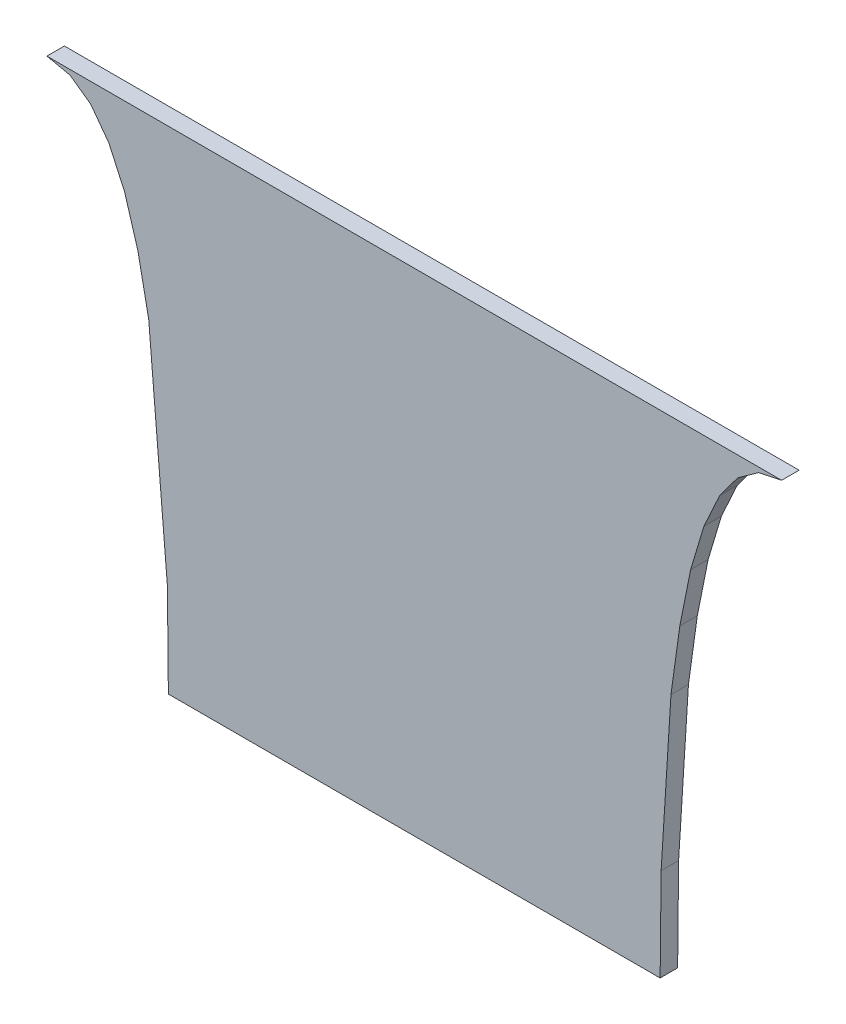
ISO-10303-21;
HEADER;
FILE_DESCRIPTION(('STEP AP214'),'2;1');
FILE_NAME('part.step','',(''),(''),'','','');
FILE_SCHEMA(('AUTOMOTIVE_DESIGN { 1 0 10303 214 1 1 1 1 }'));
ENDSEC;
DATA;
#1=APPLICATION_CONTEXT('core data for automotive mechanical design processes');
#2=APPLICATION_PROTOCOL_DEFINITION('international standard','automotive_design',2000,#1);
#3=PRODUCT_CONTEXT('',#1,'mechanical');
#4=PRODUCT('Part','Part','',(#3));
#5=PRODUCT_RELATED_PRODUCT_CATEGORY('part','',(#4));
#6=PRODUCT_DEFINITION_FORMATION('','',#4);
#7=PRODUCT_DEFINITION_CONTEXT('part definition',#1,'design');
#8=PRODUCT_DEFINITION('design','',#6,#7);
#9=PRODUCT_DEFINITION_SHAPE('','',#8);
#10=(LENGTH_UNIT() NAMED_UNIT(*) SI_UNIT(.MILLI.,.METRE.));
#11=(NAMED_UNIT(*) PLANE_ANGLE_UNIT() SI_UNIT($,.RADIAN.));
#12=(NAMED_UNIT(*) SI_UNIT($,.STERADIAN.) SOLID_ANGLE_UNIT());
#13=UNCERTAINTY_MEASURE_WITH_UNIT(LENGTH_MEASURE(1.E-05),#10,'distance_accuracy_value','');
#14=(GEOMETRIC_REPRESENTATION_CONTEXT(3) GLOBAL_UNCERTAINTY_ASSIGNED_CONTEXT((#13)) GLOBAL_UNIT_ASSIGNED_CONTEXT((#10,
#11,#12)) REPRESENTATION_CONTEXT('',''));
#15=CARTESIAN_POINT('',(0.,0.,0.));
#16=DIRECTION('',(0.,0.,1.));
#17=DIRECTION('',(1.,0.,0.));
#18=AXIS2_PLACEMENT_3D('',#15,#16,#17);
#19=CARTESIAN_POINT('',(88.4000015258789,44.3330001831055,0.));
#20=DIRECTION('',(-0.999944662980935,0.0105200273737027,0.));
#21=DIRECTION('',(0.0105200273737027,0.999944662980935,0.));
#22=AXIS2_PLACEMENT_3D('',#19,#20,#21);
#23=PLANE('',#22);
#24=DIRECTION('',(0.0105200273737027,0.999944662980935,0.));
#25=VECTOR('',#24,1.);
#26=CARTESIAN_POINT('',(88.4000015258789,44.3330001831055,0.03556));
#27=LINE('',#26,#25);
#28=CARTESIAN_POINT('',(88.4000015258789,44.3330001831055,0.03556));
#29=VERTEX_POINT('',#28);
#30=CARTESIAN_POINT('',(88.4020004272461,44.5229988098144,0.03556));
#31=VERTEX_POINT('',#30);
#32=EDGE_CURVE('E11',#29,#31,#27,.T.);
#33=ORIENTED_EDGE('',*,*,#32,.F.);
#34=DIRECTION('',(0.,0.,1.));
#35=VECTOR('',#34,1.);
#36=CARTESIAN_POINT('',(88.4000015258789,44.3330001831055,0.));
#37=LINE('',#36,#35);
#38=CARTESIAN_POINT('',(88.4000015258789,44.3330001831055,0.));
#39=VERTEX_POINT('',#38);
#40=EDGE_CURVE('E24',#39,#29,#37,.T.);
#41=ORIENTED_EDGE('',*,*,#40,.F.);
#42=DIRECTION('',(0.0105200273737027,0.999944662980935,0.));
#43=VECTOR('',#42,1.);
#44=CARTESIAN_POINT('',(88.4000015258789,44.3330001831055,0.));
#45=LINE('',#44,#43);
#46=CARTESIAN_POINT('',(88.4020004272461,44.5229988098144,0.));
#47=VERTEX_POINT('',#46);
#48=EDGE_CURVE('E166',#39,#47,#45,.T.);
#49=ORIENTED_EDGE('',*,*,#48,.T.);
#50=DIRECTION('',(0.,0.,1.));
#51=VECTOR('',#50,1.);
#52=CARTESIAN_POINT('',(88.4020004272461,44.5229988098144,0.));
#53=LINE('',#52,#51);
#54=EDGE_CURVE('E37',#47,#31,#53,.T.);
#55=ORIENTED_EDGE('',*,*,#54,.T.);
#56=EDGE_LOOP('',(#33,#41,#49,#55));
#57=FACE_BOUND('',#56,.T.);
#58=ADVANCED_FACE('F17',(#57),#23,.F.);
#59=CARTESIAN_POINT('',(88.4020004272461,44.5229988098144,0.));
#60=DIRECTION('',(-0.998053226554546,0.0623679161433246,0.));
#61=DIRECTION('',(0.0623679161433246,0.998053226554546,0.));
#62=AXIS2_PLACEMENT_3D('',#59,#60,#61);
#63=PLANE('',#62);
#64=DIRECTION('',(0.0623679161433246,0.998053226554546,0.));
#65=VECTOR('',#64,1.);
#66=CARTESIAN_POINT('',(88.4020004272461,44.5229988098144,0.03556));
#67=LINE('',#66,#65);
#68=CARTESIAN_POINT('',(88.4219970703125,44.8429985046387,0.03556));
#69=VERTEX_POINT('',#68);
#70=EDGE_CURVE('E294',#31,#69,#67,.T.);
#71=ORIENTED_EDGE('',*,*,#70,.F.);
#72=ORIENTED_EDGE('',*,*,#54,.F.);
#73=DIRECTION('',(0.0623679161433246,0.998053226554546,0.));
#74=VECTOR('',#73,1.);
#75=CARTESIAN_POINT('',(88.4020004272461,44.5229988098144,0.));
#76=LINE('',#75,#74);
#77=CARTESIAN_POINT('',(88.4219970703125,44.8429985046387,0.));
#78=VERTEX_POINT('',#77);
#79=EDGE_CURVE('E291',#47,#78,#76,.T.);
#80=ORIENTED_EDGE('',*,*,#79,.T.);
#81=DIRECTION('',(0.,0.,1.));
#82=VECTOR('',#81,1.);
#83=CARTESIAN_POINT('',(88.4219970703125,44.8429985046387,0.));
#84=LINE('',#83,#82);
#85=EDGE_CURVE('E289',#78,#69,#84,.T.);
#86=ORIENTED_EDGE('',*,*,#85,.T.);
#87=EDGE_LOOP('',(#71,#72,#80,#86));
#88=FACE_BOUND('',#87,.T.);
#89=ADVANCED_FACE('F302',(#88),#63,.F.);
#90=CARTESIAN_POINT('',(88.4219970703125,44.8429985046387,0.));
#91=DIRECTION('',(-0.990544459130472,0.137192107957858,0.));
#92=DIRECTION('',(0.137192107957858,0.990544459130472,0.));
#93=AXIS2_PLACEMENT_3D('',#90,#91,#92);
#94=PLANE('',#93);
#95=DIRECTION('',(0.137192107957858,0.990544459130472,0.));
#96=VECTOR('',#95,1.);
#97=CARTESIAN_POINT('',(88.4219970703125,44.8429985046387,0.03556));
#98=LINE('',#97,#96);
#99=CARTESIAN_POINT('',(88.4400024414062,44.9729995727539,0.03556));
#100=VERTEX_POINT('',#99);
#101=EDGE_CURVE('E286',#69,#100,#98,.T.);
#102=ORIENTED_EDGE('',*,*,#101,.F.);
#103=ORIENTED_EDGE('',*,*,#85,.F.);
#104=DIRECTION('',(0.137192107957858,0.990544459130472,0.));
#105=VECTOR('',#104,1.);
#106=CARTESIAN_POINT('',(88.4219970703125,44.8429985046387,0.));
#107=LINE('',#106,#105);
#108=CARTESIAN_POINT('',(88.4400024414062,44.9729995727539,0.));
#109=VERTEX_POINT('',#108);
#110=EDGE_CURVE('E283',#78,#109,#107,.T.);
#111=ORIENTED_EDGE('',*,*,#110,.T.);
#112=DIRECTION('',(0.,0.,1.));
#113=VECTOR('',#112,1.);
#114=CARTESIAN_POINT('',(88.4400024414062,44.9729995727539,0.));
#115=LINE('',#114,#113);
#116=EDGE_CURVE('E281',#109,#100,#115,.T.);
#117=ORIENTED_EDGE('',*,*,#116,.T.);
#118=EDGE_LOOP('',(#102,#103,#111,#117));
#119=FACE_BOUND('',#118,.T.);
#120=ADVANCED_FACE('F308',(#119),#94,.F.);
#121=CARTESIAN_POINT('',(88.4400024414062,44.9729995727539,0.));
#122=DIRECTION('',(-0.980588522376379,0.196076897628735,0.));
#123=DIRECTION('',(0.196076897628735,0.980588522376379,0.));
#124=AXIS2_PLACEMENT_3D('',#121,#122,#123);
#125=PLANE('',#124);
#126=DIRECTION('',(0.196076897628735,0.980588522376379,0.));
#127=VECTOR('',#126,1.);
#128=CARTESIAN_POINT('',(88.4400024414062,44.9729995727539,0.03556));
#129=LINE('',#128,#127);
#130=CARTESIAN_POINT('',(88.4619979858398,45.0830001831055,0.03556));
#131=VERTEX_POINT('',#130);
#132=EDGE_CURVE('E278',#100,#131,#129,.T.);
#133=ORIENTED_EDGE('',*,*,#132,.F.);
#134=ORIENTED_EDGE('',*,*,#116,.F.);
#135=DIRECTION('',(0.196076897628735,0.980588522376379,0.));
#136=VECTOR('',#135,1.);
#137=CARTESIAN_POINT('',(88.4400024414062,44.9729995727539,0.));
#138=LINE('',#137,#136);
#139=CARTESIAN_POINT('',(88.4619979858398,45.0830001831055,0.));
#140=VERTEX_POINT('',#139);
#141=EDGE_CURVE('E275',#109,#140,#138,.T.);
#142=ORIENTED_EDGE('',*,*,#141,.T.);
#143=DIRECTION('',(0.,0.,1.));
#144=VECTOR('',#143,1.);
#145=CARTESIAN_POINT('',(88.4619979858398,45.0830001831055,0.));
#146=LINE('',#145,#144);
#147=EDGE_CURVE('E273',#140,#131,#146,.T.);
#148=ORIENTED_EDGE('',*,*,#147,.T.);
#149=EDGE_LOOP('',(#133,#134,#142,#148));
#150=FACE_BOUND('',#149,.T.);
#151=ADVANCED_FACE('F310',(#150),#125,.F.);
#152=CARTESIAN_POINT('',(88.4619979858398,45.0830001831055,0.));
#153=DIRECTION('',(-0.957825167841783,0.287351610137928,0.));
#154=DIRECTION('',(0.287351610137928,0.957825167841783,0.));
#155=AXIS2_PLACEMENT_3D('',#152,#153,#154);
#156=PLANE('',#155);
#157=DIRECTION('',(0.287351610137928,0.957825167841783,0.));
#158=VECTOR('',#157,1.);
#159=CARTESIAN_POINT('',(88.4619979858398,45.0830001831055,0.03556));
#160=LINE('',#159,#158);
#161=CARTESIAN_POINT('',(88.4889984130859,45.1730003356934,0.03556));
#162=VERTEX_POINT('',#161);
#163=EDGE_CURVE('E270',#131,#162,#160,.T.);
#164=ORIENTED_EDGE('',*,*,#163,.F.);
#165=ORIENTED_EDGE('',*,*,#147,.F.);
#166=DIRECTION('',(0.287351610137928,0.957825167841783,0.));
#167=VECTOR('',#166,1.);
#168=CARTESIAN_POINT('',(88.4619979858398,45.0830001831055,0.));
#169=LINE('',#168,#167);
#170=CARTESIAN_POINT('',(88.4889984130859,45.1730003356934,0.));
#171=VERTEX_POINT('',#170);
#172=EDGE_CURVE('E267',#140,#171,#169,.T.);
#173=ORIENTED_EDGE('',*,*,#172,.T.);
#174=DIRECTION('',(0.,0.,1.));
#175=VECTOR('',#174,1.);
#176=CARTESIAN_POINT('',(88.4889984130859,45.1730003356934,0.));
#177=LINE('',#176,#175);
#178=EDGE_CURVE('E265',#171,#162,#177,.T.);
#179=ORIENTED_EDGE('',*,*,#178,.T.);
#180=EDGE_LOOP('',(#164,#165,#173,#179));
#181=FACE_BOUND('',#180,.T.);
#182=ADVANCED_FACE('F315',(#181),#156,.F.);
#183=CARTESIAN_POINT('',(88.4889984130859,45.1730003356934,0.));
#184=DIRECTION('',(-0.909447701960834,0.415818322585907,0.));
#185=DIRECTION('',(0.415818322585907,0.909447701960834,0.));
#186=AXIS2_PLACEMENT_3D('',#183,#184,#185);
#187=PLANE('',#186);
#188=DIRECTION('',(0.415818322585907,0.909447701960834,0.));
#189=VECTOR('',#188,1.);
#190=CARTESIAN_POINT('',(88.4889984130859,45.1730003356934,0.03556));
#191=LINE('',#190,#189);
#192=CARTESIAN_POINT('',(88.5210037231445,45.2430000305176,0.03556));
#193=VERTEX_POINT('',#192);
#194=EDGE_CURVE('E262',#162,#193,#191,.T.);
#195=ORIENTED_EDGE('',*,*,#194,.F.);
#196=ORIENTED_EDGE('',*,*,#178,.F.);
#197=DIRECTION('',(0.415818322585907,0.909447701960834,0.));
#198=VECTOR('',#197,1.);
#199=CARTESIAN_POINT('',(88.4889984130859,45.1730003356934,0.));
#200=LINE('',#199,#198);
#201=CARTESIAN_POINT('',(88.5210037231445,45.2430000305176,0.));
#202=VERTEX_POINT('',#201);
#203=EDGE_CURVE('E259',#171,#202,#200,.T.);
#204=ORIENTED_EDGE('',*,*,#203,.T.);
#205=DIRECTION('',(0.,0.,1.));
#206=VECTOR('',#205,1.);
#207=CARTESIAN_POINT('',(88.5210037231445,45.2430000305176,0.));
#208=LINE('',#207,#206);
#209=EDGE_CURVE('E257',#202,#193,#208,.T.);
#210=ORIENTED_EDGE('',*,*,#209,.T.);
#211=EDGE_LOOP('',(#195,#196,#204,#210));
#212=FACE_BOUND('',#211,.T.);
#213=ADVANCED_FACE('F318',(#212),#187,.F.);
#214=CARTESIAN_POINT('',(88.5210037231445,45.2430000305176,0.));
#215=DIRECTION('',(-0.803876503017162,0.594796240654645,0.));
#216=DIRECTION('',(0.594796240654645,0.803876503017162,0.));
#217=AXIS2_PLACEMENT_3D('',#214,#215,#216);
#218=PLANE('',#217);
#219=DIRECTION('',(0.594796240654645,0.803876503017162,0.));
#220=VECTOR('',#219,1.);
#221=CARTESIAN_POINT('',(88.5210037231445,45.2430000305176,0.03556));
#222=LINE('',#221,#220);
#223=CARTESIAN_POINT('',(88.5579986572266,45.2929992675781,0.03556));
#224=VERTEX_POINT('',#223);
#225=EDGE_CURVE('E254',#193,#224,#222,.T.);
#226=ORIENTED_EDGE('',*,*,#225,.F.);
#227=ORIENTED_EDGE('',*,*,#209,.F.);
#228=DIRECTION('',(0.594796240654645,0.803876503017162,0.));
#229=VECTOR('',#228,1.);
#230=CARTESIAN_POINT('',(88.5210037231445,45.2430000305176,0.));
#231=LINE('',#230,#229);
#232=CARTESIAN_POINT('',(88.5579986572266,45.2929992675781,0.));
#233=VERTEX_POINT('',#232);
#234=EDGE_CURVE('E251',#202,#233,#231,.T.);
#235=ORIENTED_EDGE('',*,*,#234,.T.);
#236=DIRECTION('',(0.,0.,1.));
#237=VECTOR('',#236,1.);
#238=CARTESIAN_POINT('',(88.5579986572266,45.2929992675781,0.));
#239=LINE('',#238,#237);
#240=EDGE_CURVE('E249',#233,#224,#239,.T.);
#241=ORIENTED_EDGE('',*,*,#240,.T.);
#242=EDGE_LOOP('',(#226,#227,#235,#241));
#243=FACE_BOUND('',#242,.T.);
#244=ADVANCED_FACE('F323',(#243),#218,.F.);
#245=CARTESIAN_POINT('',(88.5579986572266,45.2929992675781,0.));
#246=DIRECTION('',(-0.58127314887122,0.813708502107073,0.));
#247=DIRECTION('',(0.813708502107073,0.58127314887122,0.));
#248=AXIS2_PLACEMENT_3D('',#245,#246,#247);
#249=PLANE('',#248);
#250=DIRECTION('',(0.813708502107073,0.58127314887122,0.));
#251=VECTOR('',#250,1.);
#252=CARTESIAN_POINT('',(88.5579986572266,45.2929992675781,0.03556));
#253=LINE('',#252,#251);
#254=CARTESIAN_POINT('',(88.5999984741211,45.3230018615723,0.03556));
#255=VERTEX_POINT('',#254);
#256=EDGE_CURVE('E246',#224,#255,#253,.T.);
#257=ORIENTED_EDGE('',*,*,#256,.F.);
#258=ORIENTED_EDGE('',*,*,#240,.F.);
#259=DIRECTION('',(0.813708502107073,0.58127314887122,0.));
#260=VECTOR('',#259,1.);
#261=CARTESIAN_POINT('',(88.5579986572266,45.2929992675781,0.));
#262=LINE('',#261,#260);
#263=CARTESIAN_POINT('',(88.5999984741211,45.3230018615723,0.));
#264=VERTEX_POINT('',#263);
#265=EDGE_CURVE('E243',#233,#264,#262,.T.);
#266=ORIENTED_EDGE('',*,*,#265,.T.);
#267=DIRECTION('',(0.,0.,1.));
#268=VECTOR('',#267,1.);
#269=CARTESIAN_POINT('',(88.5999984741211,45.3230018615723,0.));
#270=LINE('',#269,#268);
#271=EDGE_CURVE('E241',#264,#255,#270,.T.);
#272=ORIENTED_EDGE('',*,*,#271,.T.);
#273=EDGE_LOOP('',(#257,#258,#266,#272));
#274=FACE_BOUND('',#273,.T.);
#275=ADVANCED_FACE('F326',(#274),#249,.F.);
#276=CARTESIAN_POINT('',(88.5999984741211,45.3230018615723,0.));
#277=DIRECTION('',(-0.208054323241225,0.97811727240686,0.));
#278=DIRECTION('',(0.97811727240686,0.208054323241225,0.));
#279=AXIS2_PLACEMENT_3D('',#276,#277,#278);
#280=PLANE('',#279);
#281=DIRECTION('',(0.97811727240686,0.208054323241225,0.));
#282=VECTOR('',#281,1.);
#283=CARTESIAN_POINT('',(88.5999984741211,45.3230018615723,0.03556));
#284=LINE('',#283,#282);
#285=CARTESIAN_POINT('',(88.6470031738281,45.3330001831055,0.03556));
#286=VERTEX_POINT('',#285);
#287=EDGE_CURVE('E238',#255,#286,#284,.T.);
#288=ORIENTED_EDGE('',*,*,#287,.F.);
#289=ORIENTED_EDGE('',*,*,#271,.F.);
#290=DIRECTION('',(0.97811727240686,0.208054323241225,0.));
#291=VECTOR('',#290,1.);
#292=CARTESIAN_POINT('',(88.5999984741211,45.3230018615723,0.));
#293=LINE('',#292,#291);
#294=CARTESIAN_POINT('',(88.6470031738281,45.3330001831055,0.));
#295=VERTEX_POINT('',#294);
#296=EDGE_CURVE('E235',#264,#295,#293,.T.);
#297=ORIENTED_EDGE('',*,*,#296,.T.);
#298=DIRECTION('',(0.,0.,1.));
#299=VECTOR('',#298,1.);
#300=CARTESIAN_POINT('',(88.6470031738281,45.3330001831055,0.));
#301=LINE('',#300,#299);
#302=EDGE_CURVE('E233',#295,#286,#301,.T.);
#303=ORIENTED_EDGE('',*,*,#302,.T.);
#304=EDGE_LOOP('',(#288,#289,#297,#303));
#305=FACE_BOUND('',#304,.T.);
#306=ADVANCED_FACE('F331',(#305),#280,.F.);
#307=CARTESIAN_POINT('',(88.6470031738281,45.3330001831055,0.));
#308=DIRECTION('',(0.,-1.,0.));
#309=DIRECTION('',(-1.,0.,0.));
#310=AXIS2_PLACEMENT_3D('',#307,#308,#309);
#311=PLANE('',#310);
#312=DIRECTION('',(-1.,0.,0.));
#313=VECTOR('',#312,1.);
#314=CARTESIAN_POINT('',(88.6470031738281,45.3330001831055,0.03556));
#315=LINE('',#314,#313);
#316=CARTESIAN_POINT('',(87.1529998779297,45.3330001831055,0.03556));
#317=VERTEX_POINT('',#316);
#318=EDGE_CURVE('E230',#286,#317,#315,.T.);
#319=ORIENTED_EDGE('',*,*,#318,.F.);
#320=ORIENTED_EDGE('',*,*,#302,.F.);
#321=DIRECTION('',(-1.,0.,0.));
#322=VECTOR('',#321,1.);
#323=CARTESIAN_POINT('',(88.6470031738281,45.3330001831055,0.));
#324=LINE('',#323,#322);
#325=CARTESIAN_POINT('',(87.1529998779297,45.3330001831055,0.));
#326=VERTEX_POINT('',#325);
#327=EDGE_CURVE('E227',#295,#326,#324,.T.);
#328=ORIENTED_EDGE('',*,*,#327,.T.);
#329=DIRECTION('',(0.,0.,1.));
#330=VECTOR('',#329,1.);
#331=CARTESIAN_POINT('',(87.1529998779297,45.3330001831055,0.));
#332=LINE('',#331,#330);
#333=EDGE_CURVE('E225',#326,#317,#332,.T.);
#334=ORIENTED_EDGE('',*,*,#333,.T.);
#335=EDGE_LOOP('',(#319,#320,#328,#334));
#336=FACE_BOUND('',#335,.T.);
#337=ADVANCED_FACE('F334',(#336),#311,.F.);
#338=CARTESIAN_POINT('',(87.1529998779297,45.3330001831055,0.));
#339=DIRECTION('',(0.208086635945853,0.978110398646665,0.));
#340=DIRECTION('',(0.978110398646665,-0.208086635945853,0.));
#341=AXIS2_PLACEMENT_3D('',#338,#339,#340);
#342=PLANE('',#341);
#343=DIRECTION('',(0.978110398646665,-0.208086635945853,0.));
#344=VECTOR('',#343,1.);
#345=CARTESIAN_POINT('',(87.1529998779297,45.3330001831055,0.03556));
#346=LINE('',#345,#344);
#347=CARTESIAN_POINT('',(87.1999969482422,45.3230018615723,0.03556));
#348=VERTEX_POINT('',#347);
#349=EDGE_CURVE('E222',#317,#348,#346,.T.);
#350=ORIENTED_EDGE('',*,*,#349,.F.);
#351=ORIENTED_EDGE('',*,*,#333,.F.);
#352=DIRECTION('',(0.978110398646665,-0.208086635945853,0.));
#353=VECTOR('',#352,1.);
#354=CARTESIAN_POINT('',(87.1529998779297,45.3330001831055,0.));
#355=LINE('',#354,#353);
#356=CARTESIAN_POINT('',(87.1999969482422,45.3230018615723,0.));
#357=VERTEX_POINT('',#356);
#358=EDGE_CURVE('E219',#326,#357,#355,.T.);
#359=ORIENTED_EDGE('',*,*,#358,.T.);
#360=DIRECTION('',(0.,0.,1.));
#361=VECTOR('',#360,1.);
#362=CARTESIAN_POINT('',(87.1999969482422,45.3230018615723,0.));
#363=LINE('',#362,#361);
#364=EDGE_CURVE('E217',#357,#348,#363,.T.);
#365=ORIENTED_EDGE('',*,*,#364,.T.);
#366=EDGE_LOOP('',(#350,#351,#359,#365));
#367=FACE_BOUND('',#366,.T.);
#368=ADVANCED_FACE('F339',(#367),#342,.F.);
#369=CARTESIAN_POINT('',(87.1999969482422,45.3230018615723,0.));
#370=DIRECTION('',(0.58127314887122,0.813708502107073,0.));
#371=DIRECTION('',(0.813708502107073,-0.58127314887122,0.));
#372=AXIS2_PLACEMENT_3D('',#369,#370,#371);
#373=PLANE('',#372);
#374=DIRECTION('',(0.813708502107073,-0.58127314887122,0.));
#375=VECTOR('',#374,1.);
#376=CARTESIAN_POINT('',(87.1999969482422,45.3230018615723,0.03556));
#377=LINE('',#376,#375);
#378=CARTESIAN_POINT('',(87.2419967651367,45.2929992675781,0.03556));
#379=VERTEX_POINT('',#378);
#380=EDGE_CURVE('E214',#348,#379,#377,.T.);
#381=ORIENTED_EDGE('',*,*,#380,.F.);
#382=ORIENTED_EDGE('',*,*,#364,.F.);
#383=DIRECTION('',(0.813708502107073,-0.58127314887122,0.));
#384=VECTOR('',#383,1.);
#385=CARTESIAN_POINT('',(87.1999969482422,45.3230018615723,0.));
#386=LINE('',#385,#384);
#387=CARTESIAN_POINT('',(87.2419967651367,45.2929992675781,0.));
#388=VERTEX_POINT('',#387);
#389=EDGE_CURVE('E211',#357,#388,#386,.T.);
#390=ORIENTED_EDGE('',*,*,#389,.T.);
#391=DIRECTION('',(0.,0.,1.));
#392=VECTOR('',#391,1.);
#393=CARTESIAN_POINT('',(87.2419967651367,45.2929992675781,0.));
#394=LINE('',#393,#392);
#395=EDGE_CURVE('E209',#388,#379,#394,.T.);
#396=ORIENTED_EDGE('',*,*,#395,.T.);
#397=EDGE_LOOP('',(#381,#382,#390,#396));
#398=FACE_BOUND('',#397,.T.);
#399=ADVANCED_FACE('F342',(#398),#373,.F.);
#400=CARTESIAN_POINT('',(87.2419967651367,45.2929992675781,0.));
#401=DIRECTION('',(0.803817852637325,0.594875499395899,0.));
#402=DIRECTION('',(0.594875499395899,-0.803817852637325,0.));
#403=AXIS2_PLACEMENT_3D('',#400,#401,#402);
#404=PLANE('',#403);
#405=DIRECTION('',(0.594875499395899,-0.803817852637325,0.));
#406=VECTOR('',#405,1.);
#407=CARTESIAN_POINT('',(87.2419967651367,45.2929992675781,0.03556));
#408=LINE('',#407,#406);
#409=CARTESIAN_POINT('',(87.2789993286133,45.2430000305176,0.03556));
#410=VERTEX_POINT('',#409);
#411=EDGE_CURVE('E206',#379,#410,#408,.T.);
#412=ORIENTED_EDGE('',*,*,#411,.F.);
#413=ORIENTED_EDGE('',*,*,#395,.F.);
#414=DIRECTION('',(0.594875499395899,-0.803817852637325,0.));
#415=VECTOR('',#414,1.);
#416=CARTESIAN_POINT('',(87.2419967651367,45.2929992675781,0.));
#417=LINE('',#416,#415);
#418=CARTESIAN_POINT('',(87.2789993286133,45.2430000305176,0.));
#419=VERTEX_POINT('',#418);
#420=EDGE_CURVE('E203',#388,#419,#417,.T.);
#421=ORIENTED_EDGE('',*,*,#420,.T.);
#422=DIRECTION('',(0.,0.,1.));
#423=VECTOR('',#422,1.);
#424=CARTESIAN_POINT('',(87.2789993286133,45.2430000305176,0.));
#425=LINE('',#424,#423);
#426=EDGE_CURVE('E201',#419,#410,#425,.T.);
#427=ORIENTED_EDGE('',*,*,#426,.T.);
#428=EDGE_LOOP('',(#412,#413,#421,#427));
#429=FACE_BOUND('',#428,.T.);
#430=ADVANCED_FACE('F347',(#429),#404,.F.);
#431=CARTESIAN_POINT('',(87.2789993286133,45.2430000305176,0.));
#432=DIRECTION('',(0.90948518442123,0.415736333892386,0.));
#433=DIRECTION('',(0.415736333892386,-0.90948518442123,0.));
#434=AXIS2_PLACEMENT_3D('',#431,#432,#433);
#435=PLANE('',#434);
#436=DIRECTION('',(0.415736333892386,-0.90948518442123,0.));
#437=VECTOR('',#436,1.);
#438=CARTESIAN_POINT('',(87.2789993286133,45.2430000305176,0.03556));
#439=LINE('',#438,#437);
#440=CARTESIAN_POINT('',(87.3109970092773,45.1730003356934,0.03556));
#441=VERTEX_POINT('',#440);
#442=EDGE_CURVE('E198',#410,#441,#439,.T.);
#443=ORIENTED_EDGE('',*,*,#442,.F.);
#444=ORIENTED_EDGE('',*,*,#426,.F.);
#445=DIRECTION('',(0.415736333892386,-0.90948518442123,0.));
#446=VECTOR('',#445,1.);
#447=CARTESIAN_POINT('',(87.2789993286133,45.2430000305176,0.));
#448=LINE('',#447,#446);
#449=CARTESIAN_POINT('',(87.3109970092773,45.1730003356934,0.));
#450=VERTEX_POINT('',#449);
#451=EDGE_CURVE('E195',#419,#450,#448,.T.);
#452=ORIENTED_EDGE('',*,*,#451,.T.);
#453=DIRECTION('',(0.,0.,1.));
#454=VECTOR('',#453,1.);
#455=CARTESIAN_POINT('',(87.3109970092773,45.1730003356934,0.));
#456=LINE('',#455,#454);
#457=EDGE_CURVE('E193',#450,#441,#456,.T.);
#458=ORIENTED_EDGE('',*,*,#457,.T.);
#459=EDGE_LOOP('',(#443,#444,#452,#458));
#460=FACE_BOUND('',#459,.T.);
#461=ADVANCED_FACE('F350',(#460),#435,.F.);
#462=CARTESIAN_POINT('',(87.3109970092773,45.1730003356934,0.));
#463=DIRECTION('',(0.957825167841783,0.287351610137928,0.));
#464=DIRECTION('',(0.287351610137928,-0.957825167841783,0.));
#465=AXIS2_PLACEMENT_3D('',#462,#463,#464);
#466=PLANE('',#465);
#467=DIRECTION('',(0.287351610137928,-0.957825167841783,0.));
#468=VECTOR('',#467,1.);
#469=CARTESIAN_POINT('',(87.3109970092773,45.1730003356934,0.03556));
#470=LINE('',#469,#468);
#471=CARTESIAN_POINT('',(87.3379974365234,45.0830001831055,0.03556));
#472=VERTEX_POINT('',#471);
#473=EDGE_CURVE('E190',#441,#472,#470,.T.);
#474=ORIENTED_EDGE('',*,*,#473,.F.);
#475=ORIENTED_EDGE('',*,*,#457,.F.);
#476=DIRECTION('',(0.287351610137928,-0.957825167841783,0.));
#477=VECTOR('',#476,1.);
#478=CARTESIAN_POINT('',(87.3109970092773,45.1730003356934,0.));
#479=LINE('',#478,#477);
#480=CARTESIAN_POINT('',(87.3379974365234,45.0830001831055,0.));
#481=VERTEX_POINT('',#480);
#482=EDGE_CURVE('E187',#450,#481,#479,.T.);
#483=ORIENTED_EDGE('',*,*,#482,.T.);
#484=DIRECTION('',(0.,0.,1.));
#485=VECTOR('',#484,1.);
#486=CARTESIAN_POINT('',(87.3379974365234,45.0830001831055,0.));
#487=LINE('',#486,#485);
#488=EDGE_CURVE('E185',#481,#472,#487,.T.);
#489=ORIENTED_EDGE('',*,*,#488,.T.);
#490=EDGE_LOOP('',(#474,#475,#483,#489));
#491=FACE_BOUND('',#490,.T.);
#492=ADVANCED_FACE('F355',(#491),#466,.F.);
#493=CARTESIAN_POINT('',(87.3379974365234,45.0830001831055,0.));
#494=DIRECTION('',(0.980575443764812,0.196142292954482,0.));
#495=DIRECTION('',(0.196142292954482,-0.980575443764812,0.));
#496=AXIS2_PLACEMENT_3D('',#493,#494,#495);
#497=PLANE('',#496);
#498=DIRECTION('',(0.196142292954482,-0.980575443764812,0.));
#499=VECTOR('',#498,1.);
#500=CARTESIAN_POINT('',(87.3379974365234,45.0830001831055,0.03556));
#501=LINE('',#500,#499);
#502=CARTESIAN_POINT('',(87.3600006103516,44.9729995727539,0.03556));
#503=VERTEX_POINT('',#502);
#504=EDGE_CURVE('E182',#472,#503,#501,.T.);
#505=ORIENTED_EDGE('',*,*,#504,.F.);
#506=ORIENTED_EDGE('',*,*,#488,.F.);
#507=DIRECTION('',(0.196142292954482,-0.980575443764812,0.));
#508=VECTOR('',#507,1.);
#509=CARTESIAN_POINT('',(87.3379974365234,45.0830001831055,0.));
#510=LINE('',#509,#508);
#511=CARTESIAN_POINT('',(87.3600006103516,44.9729995727539,0.));
#512=VERTEX_POINT('',#511);
#513=EDGE_CURVE('E179',#481,#512,#510,.T.);
#514=ORIENTED_EDGE('',*,*,#513,.T.);
#515=DIRECTION('',(0.,0.,1.));
#516=VECTOR('',#515,1.);
#517=CARTESIAN_POINT('',(87.3600006103516,44.9729995727539,0.));
#518=LINE('',#517,#516);
#519=EDGE_CURVE('E177',#512,#503,#518,.T.);
#520=ORIENTED_EDGE('',*,*,#519,.T.);
#521=EDGE_LOOP('',(#505,#506,#514,#520));
#522=FACE_BOUND('',#521,.T.);
#523=ADVANCED_FACE('F358',(#522),#497,.F.);
#524=CARTESIAN_POINT('',(87.3600006103516,44.9729995727539,0.));
#525=DIRECTION('',(0.996453161745062,0.0841492510261884,0.));
#526=DIRECTION('',(0.0841492510261884,-0.996453161745062,0.));
#527=AXIS2_PLACEMENT_3D('',#524,#525,#526);
#528=PLANE('',#527);
#529=DIRECTION('',(0.0841492510261884,-0.996453161745062,0.));
#530=VECTOR('',#529,1.);
#531=CARTESIAN_POINT('',(87.3600006103516,44.9729995727539,0.03556));
#532=LINE('',#531,#530);
#533=CARTESIAN_POINT('',(87.3980026245117,44.5229988098144,0.03556));
#534=VERTEX_POINT('',#533);
#535=EDGE_CURVE('E174',#503,#534,#532,.T.);
#536=ORIENTED_EDGE('',*,*,#535,.F.);
#537=ORIENTED_EDGE('',*,*,#519,.F.);
#538=DIRECTION('',(0.0841492510261884,-0.996453161745062,0.));
#539=VECTOR('',#538,1.);
#540=CARTESIAN_POINT('',(87.3600006103516,44.9729995727539,0.));
#541=LINE('',#540,#539);
#542=CARTESIAN_POINT('',(87.3980026245117,44.5229988098144,0.));
#543=VERTEX_POINT('',#542);
#544=EDGE_CURVE('E172',#512,#543,#541,.T.);
#545=ORIENTED_EDGE('',*,*,#544,.T.);
#546=DIRECTION('',(0.,0.,1.));
#547=VECTOR('',#546,1.);
#548=CARTESIAN_POINT('',(87.3980026245117,44.5229988098144,0.));
#549=LINE('',#548,#547);
#550=EDGE_CURVE('E157',#543,#534,#549,.T.);
#551=ORIENTED_EDGE('',*,*,#550,.T.);
#552=EDGE_LOOP('',(#536,#537,#545,#551));
#553=FACE_BOUND('',#552,.T.);
#554=ADVANCED_FACE('F361',(#553),#528,.F.);
#555=CARTESIAN_POINT('',(87.3980026245117,44.5229988098144,0.));
#556=DIRECTION('',(0.999944662980935,0.0105200273737027,0.));
#557=DIRECTION('',(0.0105200273737027,-0.999944662980935,0.));
#558=AXIS2_PLACEMENT_3D('',#555,#556,#557);
#559=PLANE('',#558);
#560=DIRECTION('',(0.0105200273737027,-0.999944662980935,0.));
#561=VECTOR('',#560,1.);
#562=CARTESIAN_POINT('',(87.3980026245117,44.5229988098144,0.03556));
#563=LINE('',#562,#561);
#564=CARTESIAN_POINT('',(87.4000015258789,44.3330001831055,0.03556));
#565=VERTEX_POINT('',#564);
#566=EDGE_CURVE('E161',#534,#565,#563,.T.);
#567=ORIENTED_EDGE('',*,*,#566,.F.);
#568=ORIENTED_EDGE('',*,*,#550,.F.);
#569=DIRECTION('',(0.0105200273737027,-0.999944662980935,0.));
#570=VECTOR('',#569,1.);
#571=CARTESIAN_POINT('',(87.3980026245117,44.5229988098144,0.));
#572=LINE('',#571,#570);
#573=CARTESIAN_POINT('',(87.4000015258789,44.3330001831055,0.));
#574=VERTEX_POINT('',#573);
#575=EDGE_CURVE('E153',#543,#574,#572,.T.);
#576=ORIENTED_EDGE('',*,*,#575,.T.);
#577=DIRECTION('',(0.,0.,1.));
#578=VECTOR('',#577,1.);
#579=CARTESIAN_POINT('',(87.4000015258789,44.3330001831055,0.));
#580=LINE('',#579,#578);
#581=EDGE_CURVE('E143',#574,#565,#580,.T.);
#582=ORIENTED_EDGE('',*,*,#581,.T.);
#583=EDGE_LOOP('',(#567,#568,#576,#582));
#584=FACE_BOUND('',#583,.T.);
#585=ADVANCED_FACE('F156',(#584),#559,.F.);
#586=CARTESIAN_POINT('',(87.4000015258789,44.3330001831055,0.));
#587=DIRECTION('',(0.,1.,0.));
#588=DIRECTION('',(1.,0.,0.));
#589=AXIS2_PLACEMENT_3D('',#586,#587,#588);
#590=PLANE('',#589);
#591=DIRECTION('',(1.,0.,0.));
#592=VECTOR('',#591,1.);
#593=CARTESIAN_POINT('',(87.4000015258789,44.3330001831055,0.03556));
#594=LINE('',#593,#592);
#595=EDGE_CURVE('E149',#565,#29,#594,.T.);
#596=ORIENTED_EDGE('',*,*,#595,.F.);
#597=ORIENTED_EDGE('',*,*,#581,.F.);
#598=DIRECTION('',(1.,0.,0.));
#599=VECTOR('',#598,1.);
#600=CARTESIAN_POINT('',(87.4000015258789,44.3330001831055,0.));
#601=LINE('',#600,#599);
#602=EDGE_CURVE('E147',#574,#39,#601,.T.);
#603=ORIENTED_EDGE('',*,*,#602,.T.);
#604=ORIENTED_EDGE('',*,*,#40,.T.);
#605=EDGE_LOOP('',(#596,#597,#603,#604));
#606=FACE_BOUND('',#605,.T.);
#607=ADVANCED_FACE('F145',(#606),#590,.F.);
#608=CARTESIAN_POINT('',(88.4000015258789,44.3330001831055,0.));
#609=DIRECTION('',(0.,0.,1.));
#610=DIRECTION('',(1.,0.,0.));
#611=AXIS2_PLACEMENT_3D('',#608,#609,#610);
#612=PLANE('',#611);
#613=ORIENTED_EDGE('',*,*,#602,.F.);
#614=ORIENTED_EDGE('',*,*,#575,.F.);
#615=ORIENTED_EDGE('',*,*,#544,.F.);
#616=ORIENTED_EDGE('',*,*,#513,.F.);
#617=ORIENTED_EDGE('',*,*,#482,.F.);
#618=ORIENTED_EDGE('',*,*,#451,.F.);
#619=ORIENTED_EDGE('',*,*,#420,.F.);
#620=ORIENTED_EDGE('',*,*,#389,.F.);
#621=ORIENTED_EDGE('',*,*,#358,.F.);
#622=ORIENTED_EDGE('',*,*,#327,.F.);
#623=ORIENTED_EDGE('',*,*,#296,.F.);
#624=ORIENTED_EDGE('',*,*,#265,.F.);
#625=ORIENTED_EDGE('',*,*,#234,.F.);
#626=ORIENTED_EDGE('',*,*,#203,.F.);
#627=ORIENTED_EDGE('',*,*,#172,.F.);
#628=ORIENTED_EDGE('',*,*,#141,.F.);
#629=ORIENTED_EDGE('',*,*,#110,.F.);
#630=ORIENTED_EDGE('',*,*,#79,.F.);
#631=ORIENTED_EDGE('',*,*,#48,.F.);
#632=EDGE_LOOP('',(#613,#614,#615,#616,#617,#618,#619,#620,#621,#622,#623,#624,#625,#626,#627,
#628,#629,#630,#631));
#633=FACE_BOUND('',#632,.T.);
#634=ADVANCED_FACE('F164',(#633),#612,.F.);
#635=CARTESIAN_POINT('',(88.4000015258789,44.3330001831055,0.03556));
#636=DIRECTION('',(0.,0.,1.));
#637=DIRECTION('',(1.,0.,0.));
#638=AXIS2_PLACEMENT_3D('',#635,#636,#637);
#639=PLANE('',#638);
#640=ORIENTED_EDGE('',*,*,#32,.T.);
#641=ORIENTED_EDGE('',*,*,#70,.T.);
#642=ORIENTED_EDGE('',*,*,#101,.T.);
#643=ORIENTED_EDGE('',*,*,#132,.T.);
#644=ORIENTED_EDGE('',*,*,#163,.T.);
#645=ORIENTED_EDGE('',*,*,#194,.T.);
#646=ORIENTED_EDGE('',*,*,#225,.T.);
#647=ORIENTED_EDGE('',*,*,#256,.T.);
#648=ORIENTED_EDGE('',*,*,#287,.T.);
#649=ORIENTED_EDGE('',*,*,#318,.T.);
#650=ORIENTED_EDGE('',*,*,#349,.T.);
#651=ORIENTED_EDGE('',*,*,#380,.T.);
#652=ORIENTED_EDGE('',*,*,#411,.T.);
#653=ORIENTED_EDGE('',*,*,#442,.T.);
#654=ORIENTED_EDGE('',*,*,#473,.T.);
#655=ORIENTED_EDGE('',*,*,#504,.T.);
#656=ORIENTED_EDGE('',*,*,#535,.T.);
#657=ORIENTED_EDGE('',*,*,#566,.T.);
#658=ORIENTED_EDGE('',*,*,#595,.T.);
#659=EDGE_LOOP('',(#640,#641,#642,#643,#644,#645,#646,#647,#648,#649,#650,#651,#652,#653,#654,
#655,#656,#657,#658));
#660=FACE_BOUND('',#659,.T.);
#661=ADVANCED_FACE('F305',(#660),#639,.T.);
#662=CLOSED_SHELL('',(#58,#89,#120,#151,#182,#213,#244,#275,#306,#337,#368,#399,#430,#461,#492,
#523,#554,#585,#607,#634,#661));
#663=MANIFOLD_SOLID_BREP('B1',#662);
#664=ADVANCED_BREP_SHAPE_REPRESENTATION('',(#18,#663),#14);
#665=SHAPE_DEFINITION_REPRESENTATION(#9,#664);
ENDSEC;
END-ISO-10303-21;
